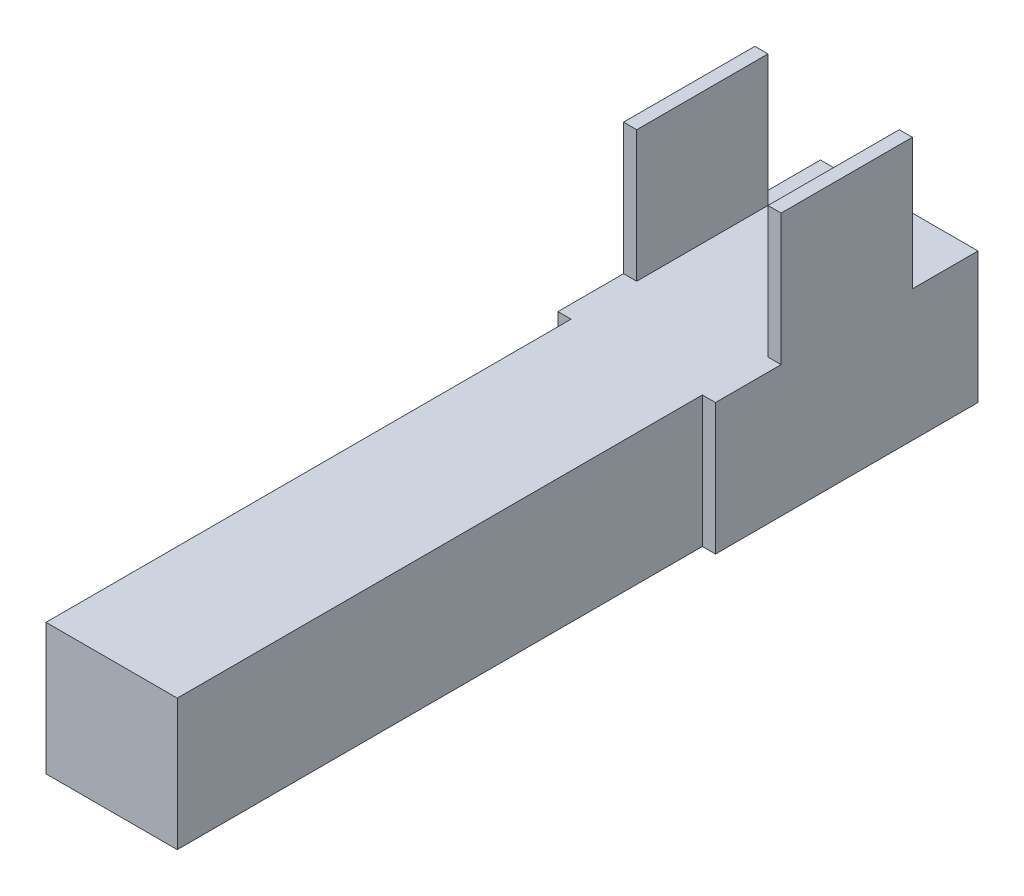
ISO-10303-21;
HEADER;
FILE_DESCRIPTION(('STEP AP214'),'2;1');
FILE_NAME('part.step','',(''),(''),'','','');
FILE_SCHEMA(('AUTOMOTIVE_DESIGN { 1 0 10303 214 1 1 1 1 }'));
ENDSEC;
DATA;
#1=APPLICATION_CONTEXT('core data for automotive mechanical design processes');
#2=APPLICATION_PROTOCOL_DEFINITION('international standard','automotive_design',2000,#1);
#3=PRODUCT_CONTEXT('',#1,'mechanical');
#4=PRODUCT('Part','Part','',(#3));
#5=PRODUCT_RELATED_PRODUCT_CATEGORY('part','',(#4));
#6=PRODUCT_DEFINITION_FORMATION('','',#4);
#7=PRODUCT_DEFINITION_CONTEXT('part definition',#1,'design');
#8=PRODUCT_DEFINITION('design','',#6,#7);
#9=PRODUCT_DEFINITION_SHAPE('','',#8);
#10=(LENGTH_UNIT() NAMED_UNIT(*) SI_UNIT(.MILLI.,.METRE.));
#11=(NAMED_UNIT(*) PLANE_ANGLE_UNIT() SI_UNIT($,.RADIAN.));
#12=(NAMED_UNIT(*) SI_UNIT($,.STERADIAN.) SOLID_ANGLE_UNIT());
#13=UNCERTAINTY_MEASURE_WITH_UNIT(LENGTH_MEASURE(1.E-05),#10,'distance_accuracy_value','');
#14=(GEOMETRIC_REPRESENTATION_CONTEXT(3) GLOBAL_UNCERTAINTY_ASSIGNED_CONTEXT((#13)) GLOBAL_UNIT_ASSIGNED_CONTEXT((#10,
#11,#12)) REPRESENTATION_CONTEXT('',''));
#15=CARTESIAN_POINT('',(0.,0.,0.));
#16=DIRECTION('',(0.,0.,1.));
#17=DIRECTION('',(1.,0.,0.));
#18=AXIS2_PLACEMENT_3D('',#15,#16,#17);
#19=CARTESIAN_POINT('',(0.,25.4,0.));
#20=DIRECTION('',(0.,-1.,0.));
#21=DIRECTION('',(0.,0.,-1.));
#22=AXIS2_PLACEMENT_3D('',#19,#20,#21);
#23=PLANE('',#22);
#24=DIRECTION('',(0.,0.,1.));
#25=VECTOR('',#24,1.);
#26=CARTESIAN_POINT('',(-12.7,25.4,-114.3));
#27=LINE('',#26,#25);
#28=CARTESIAN_POINT('',(-12.7,25.4,-139.7));
#29=VERTEX_POINT('',#28);
#30=CARTESIAN_POINT('',(-12.7,25.4,-114.3));
#31=VERTEX_POINT('',#30);
#32=EDGE_CURVE('E52',#29,#31,#27,.T.);
#33=ORIENTED_EDGE('',*,*,#32,.T.);
#34=DIRECTION('',(-1.,0.,0.));
#35=VECTOR('',#34,1.);
#36=CARTESIAN_POINT('',(-12.7,25.4,-114.3));
#37=LINE('',#36,#35);
#38=CARTESIAN_POINT('',(-15.24,25.4,-114.3));
#39=VERTEX_POINT('',#38);
#40=EDGE_CURVE('E181',#31,#39,#37,.T.);
#41=ORIENTED_EDGE('',*,*,#40,.T.);
#42=DIRECTION('',(0.,0.,1.));
#43=VECTOR('',#42,1.);
#44=CARTESIAN_POINT('',(-15.24,25.4,-152.4));
#45=LINE('',#44,#43);
#46=CARTESIAN_POINT('',(-15.24,25.4,-101.6));
#47=VERTEX_POINT('',#46);
#48=EDGE_CURVE('E158',#39,#47,#45,.T.);
#49=ORIENTED_EDGE('',*,*,#48,.T.);
#50=DIRECTION('',(1.,0.,0.));
#51=VECTOR('',#50,1.);
#52=CARTESIAN_POINT('',(-15.24,25.4,-101.6));
#53=LINE('',#52,#51);
#54=CARTESIAN_POINT('',(-12.7,25.4,-101.6));
#55=VERTEX_POINT('',#54);
#56=EDGE_CURVE('E198',#47,#55,#53,.T.);
#57=ORIENTED_EDGE('',*,*,#56,.T.);
#58=DIRECTION('',(0.,0.,-1.));
#59=VECTOR('',#58,1.);
#60=CARTESIAN_POINT('',(-12.7,25.4,0.));
#61=LINE('',#60,#59);
#62=CARTESIAN_POINT('',(-12.7,25.4,0.));
#63=VERTEX_POINT('',#62);
#64=EDGE_CURVE('E207',#63,#55,#61,.T.);
#65=ORIENTED_EDGE('',*,*,#64,.F.);
#66=DIRECTION('',(1.,0.,0.));
#67=VECTOR('',#66,1.);
#68=CARTESIAN_POINT('',(0.,25.4,0.));
#69=LINE('',#68,#67);
#70=CARTESIAN_POINT('',(12.7,25.4,0.));
#71=VERTEX_POINT('',#70);
#72=EDGE_CURVE('E265',#63,#71,#69,.T.);
#73=ORIENTED_EDGE('',*,*,#72,.T.);
#74=DIRECTION('',(0.,0.,-1.));
#75=VECTOR('',#74,1.);
#76=CARTESIAN_POINT('',(12.7,25.4,0.));
#77=LINE('',#76,#75);
#78=CARTESIAN_POINT('',(12.7,25.4,-101.6));
#79=VERTEX_POINT('',#78);
#80=EDGE_CURVE('E267',#71,#79,#77,.T.);
#81=ORIENTED_EDGE('',*,*,#80,.T.);
#82=DIRECTION('',(-1.,0.,0.));
#83=VECTOR('',#82,1.);
#84=CARTESIAN_POINT('',(15.24,25.4,-101.6));
#85=LINE('',#84,#83);
#86=CARTESIAN_POINT('',(15.24,25.4,-101.6));
#87=VERTEX_POINT('',#86);
#88=EDGE_CURVE('E262',#87,#79,#85,.T.);
#89=ORIENTED_EDGE('',*,*,#88,.F.);
#90=DIRECTION('',(0.,0.,1.));
#91=VECTOR('',#90,1.);
#92=CARTESIAN_POINT('',(15.24,25.4,-152.4));
#93=LINE('',#92,#91);
#94=CARTESIAN_POINT('',(15.24,25.4,-114.3));
#95=VERTEX_POINT('',#94);
#96=EDGE_CURVE('E249',#95,#87,#93,.T.);
#97=ORIENTED_EDGE('',*,*,#96,.F.);
#98=DIRECTION('',(1.,0.,0.));
#99=VECTOR('',#98,1.);
#100=CARTESIAN_POINT('',(12.7,25.4,-114.3));
#101=LINE('',#100,#99);
#102=CARTESIAN_POINT('',(12.7,25.4,-114.3));
#103=VERTEX_POINT('',#102);
#104=EDGE_CURVE('E219',#103,#95,#101,.T.);
#105=ORIENTED_EDGE('',*,*,#104,.F.);
#106=DIRECTION('',(0.,0.,1.));
#107=VECTOR('',#106,1.);
#108=CARTESIAN_POINT('',(12.7,25.4,-114.3));
#109=LINE('',#108,#107);
#110=CARTESIAN_POINT('',(12.7,25.4,-139.7));
#111=VERTEX_POINT('',#110);
#112=EDGE_CURVE('E228',#111,#103,#109,.T.);
#113=ORIENTED_EDGE('',*,*,#112,.F.);
#114=DIRECTION('',(-1.,0.,0.));
#115=VECTOR('',#114,1.);
#116=CARTESIAN_POINT('',(12.7,25.4,-139.7));
#117=LINE('',#116,#115);
#118=CARTESIAN_POINT('',(15.24,25.4,-139.7));
#119=VERTEX_POINT('',#118);
#120=EDGE_CURVE('E214',#119,#111,#117,.T.);
#121=ORIENTED_EDGE('',*,*,#120,.F.);
#122=CARTESIAN_POINT('',(15.24,25.4,-152.4));
#123=VERTEX_POINT('',#122);
#124=EDGE_CURVE('E245',#123,#119,#93,.T.);
#125=ORIENTED_EDGE('',*,*,#124,.F.);
#126=DIRECTION('',(-1.,0.,0.));
#127=VECTOR('',#126,1.);
#128=CARTESIAN_POINT('',(0.,25.4,-152.4));
#129=LINE('',#128,#127);
#130=CARTESIAN_POINT('',(-15.24,25.4,-152.4));
#131=VERTEX_POINT('',#130);
#132=EDGE_CURVE('E45',#123,#131,#129,.T.);
#133=ORIENTED_EDGE('',*,*,#132,.T.);
#134=CARTESIAN_POINT('',(-15.24,25.4,-139.7));
#135=VERTEX_POINT('',#134);
#136=EDGE_CURVE('E189',#131,#135,#45,.T.);
#137=ORIENTED_EDGE('',*,*,#136,.T.);
#138=DIRECTION('',(1.,0.,0.));
#139=VECTOR('',#138,1.);
#140=CARTESIAN_POINT('',(-12.7,25.4,-139.7));
#141=LINE('',#140,#139);
#142=EDGE_CURVE('E57',#135,#29,#141,.T.);
#143=ORIENTED_EDGE('',*,*,#142,.T.);
#144=EDGE_LOOP('',(#33,#41,#49,#57,#65,#73,#81,#89,#97,#105,#113,#121,#125,#133,#137,#143));
#145=FACE_BOUND('',#144,.T.);
#146=ADVANCED_FACE('F37',(#145),#23,.F.);
#147=CARTESIAN_POINT('',(0.,25.4,0.));
#148=DIRECTION('',(0.,0.,-1.));
#149=DIRECTION('',(-1.,0.,0.));
#150=AXIS2_PLACEMENT_3D('',#147,#148,#149);
#151=PLANE('',#150);
#152=DIRECTION('',(1.,0.,0.));
#153=VECTOR('',#152,1.);
#154=CARTESIAN_POINT('',(0.,0.,0.));
#155=LINE('',#154,#153);
#156=CARTESIAN_POINT('',(-12.7,0.,0.));
#157=VERTEX_POINT('',#156);
#158=CARTESIAN_POINT('',(12.7,0.,0.));
#159=VERTEX_POINT('',#158);
#160=EDGE_CURVE('E264',#157,#159,#155,.T.);
#161=ORIENTED_EDGE('',*,*,#160,.T.);
#162=DIRECTION('',(0.,-1.,0.));
#163=VECTOR('',#162,1.);
#164=CARTESIAN_POINT('',(12.7,25.4,0.));
#165=LINE('',#164,#163);
#166=EDGE_CURVE('E11',#71,#159,#165,.T.);
#167=ORIENTED_EDGE('',*,*,#166,.F.);
#168=ORIENTED_EDGE('',*,*,#72,.F.);
#169=DIRECTION('',(0.,-1.,0.));
#170=VECTOR('',#169,1.);
#171=CARTESIAN_POINT('',(-12.7,25.4,0.));
#172=LINE('',#171,#170);
#173=EDGE_CURVE('E209',#63,#157,#172,.T.);
#174=ORIENTED_EDGE('',*,*,#173,.T.);
#175=EDGE_LOOP('',(#161,#167,#168,#174));
#176=FACE_BOUND('',#175,.T.);
#177=ADVANCED_FACE('F39',(#176),#151,.F.);
#178=CARTESIAN_POINT('',(12.7,25.4,0.));
#179=DIRECTION('',(-1.,0.,0.));
#180=DIRECTION('',(0.,0.,1.));
#181=AXIS2_PLACEMENT_3D('',#178,#179,#180);
#182=PLANE('',#181);
#183=DIRECTION('',(0.,0.,-1.));
#184=VECTOR('',#183,1.);
#185=CARTESIAN_POINT('',(12.7,0.,0.));
#186=LINE('',#185,#184);
#187=CARTESIAN_POINT('',(12.7,0.,-101.6));
#188=VERTEX_POINT('',#187);
#189=EDGE_CURVE('E273',#159,#188,#186,.T.);
#190=ORIENTED_EDGE('',*,*,#189,.T.);
#191=DIRECTION('',(0.,1.,0.));
#192=VECTOR('',#191,1.);
#193=CARTESIAN_POINT('',(12.7,0.,-101.6));
#194=LINE('',#193,#192);
#195=EDGE_CURVE('E244',#188,#79,#194,.T.);
#196=ORIENTED_EDGE('',*,*,#195,.T.);
#197=ORIENTED_EDGE('',*,*,#80,.F.);
#198=ORIENTED_EDGE('',*,*,#166,.T.);
#199=EDGE_LOOP('',(#190,#196,#197,#198));
#200=FACE_BOUND('',#199,.T.);
#201=ADVANCED_FACE('F297',(#200),#182,.F.);
#202=CARTESIAN_POINT('',(0.,25.4,-152.4));
#203=DIRECTION('',(0.,0.,1.));
#204=DIRECTION('',(1.,0.,0.));
#205=AXIS2_PLACEMENT_3D('',#202,#203,#204);
#206=PLANE('',#205);
#207=DIRECTION('',(-1.,0.,0.));
#208=VECTOR('',#207,1.);
#209=CARTESIAN_POINT('',(0.,0.,-152.4));
#210=LINE('',#209,#208);
#211=CARTESIAN_POINT('',(15.24,0.,-152.4));
#212=VERTEX_POINT('',#211);
#213=CARTESIAN_POINT('',(-15.24,0.,-152.4));
#214=VERTEX_POINT('',#213);
#215=EDGE_CURVE('E268',#212,#214,#210,.T.);
#216=ORIENTED_EDGE('',*,*,#215,.T.);
#217=DIRECTION('',(0.,1.,0.));
#218=VECTOR('',#217,1.);
#219=CARTESIAN_POINT('',(-15.24,0.,-152.4));
#220=LINE('',#219,#218);
#221=EDGE_CURVE('E191',#214,#131,#220,.T.);
#222=ORIENTED_EDGE('',*,*,#221,.T.);
#223=ORIENTED_EDGE('',*,*,#132,.F.);
#224=DIRECTION('',(0.,1.,0.));
#225=VECTOR('',#224,1.);
#226=CARTESIAN_POINT('',(15.24,0.,-152.4));
#227=LINE('',#226,#225);
#228=EDGE_CURVE('E255',#212,#123,#227,.T.);
#229=ORIENTED_EDGE('',*,*,#228,.F.);
#230=EDGE_LOOP('',(#216,#222,#223,#229));
#231=FACE_BOUND('',#230,.T.);
#232=ADVANCED_FACE('F278',(#231),#206,.F.);
#233=CARTESIAN_POINT('',(0.,0.,0.));
#234=DIRECTION('',(0.,-1.,0.));
#235=DIRECTION('',(0.,0.,-1.));
#236=AXIS2_PLACEMENT_3D('',#233,#234,#235);
#237=PLANE('',#236);
#238=ORIENTED_EDGE('',*,*,#160,.F.);
#239=DIRECTION('',(0.,0.,-1.));
#240=VECTOR('',#239,1.);
#241=CARTESIAN_POINT('',(-12.7,0.,0.));
#242=LINE('',#241,#240);
#243=CARTESIAN_POINT('',(-12.7,0.,-101.6));
#244=VERTEX_POINT('',#243);
#245=EDGE_CURVE('E206',#157,#244,#242,.T.);
#246=ORIENTED_EDGE('',*,*,#245,.T.);
#247=DIRECTION('',(1.,0.,0.));
#248=VECTOR('',#247,1.);
#249=CARTESIAN_POINT('',(-15.24,0.,-101.6));
#250=LINE('',#249,#248);
#251=CARTESIAN_POINT('',(-15.24,0.,-101.6));
#252=VERTEX_POINT('',#251);
#253=EDGE_CURVE('E203',#252,#244,#250,.T.);
#254=ORIENTED_EDGE('',*,*,#253,.F.);
#255=DIRECTION('',(0.,0.,1.));
#256=VECTOR('',#255,1.);
#257=CARTESIAN_POINT('',(-15.24,0.,-152.4));
#258=LINE('',#257,#256);
#259=EDGE_CURVE('E194',#214,#252,#258,.T.);
#260=ORIENTED_EDGE('',*,*,#259,.F.);
#261=ORIENTED_EDGE('',*,*,#215,.F.);
#262=DIRECTION('',(0.,0.,1.));
#263=VECTOR('',#262,1.);
#264=CARTESIAN_POINT('',(15.24,0.,-152.4));
#265=LINE('',#264,#263);
#266=CARTESIAN_POINT('',(15.24,0.,-101.6));
#267=VERTEX_POINT('',#266);
#268=EDGE_CURVE('E252',#212,#267,#265,.T.);
#269=ORIENTED_EDGE('',*,*,#268,.T.);
#270=DIRECTION('',(-1.,0.,0.));
#271=VECTOR('',#270,1.);
#272=CARTESIAN_POINT('',(15.24,0.,-101.6));
#273=LINE('',#272,#271);
#274=EDGE_CURVE('E258',#267,#188,#273,.T.);
#275=ORIENTED_EDGE('',*,*,#274,.T.);
#276=ORIENTED_EDGE('',*,*,#189,.F.);
#277=EDGE_LOOP('',(#238,#246,#254,#260,#261,#269,#275,#276));
#278=FACE_BOUND('',#277,.T.);
#279=ADVANCED_FACE('F283',(#278),#237,.T.);
#280=CARTESIAN_POINT('',(15.24,0.,-101.6));
#281=DIRECTION('',(0.,0.,1.));
#282=DIRECTION('',(1.,0.,0.));
#283=AXIS2_PLACEMENT_3D('',#280,#281,#282);
#284=PLANE('',#283);
#285=ORIENTED_EDGE('',*,*,#195,.F.);
#286=ORIENTED_EDGE('',*,*,#274,.F.);
#287=DIRECTION('',(0.,1.,0.));
#288=VECTOR('',#287,1.);
#289=CARTESIAN_POINT('',(15.24,0.,-101.6));
#290=LINE('',#289,#288);
#291=EDGE_CURVE('E248',#267,#87,#290,.T.);
#292=ORIENTED_EDGE('',*,*,#291,.T.);
#293=ORIENTED_EDGE('',*,*,#88,.T.);
#294=EDGE_LOOP('',(#285,#286,#292,#293));
#295=FACE_BOUND('',#294,.T.);
#296=ADVANCED_FACE('F293',(#295),#284,.T.);
#297=CARTESIAN_POINT('',(15.24,0.,0.));
#298=DIRECTION('',(-1.,0.,0.));
#299=DIRECTION('',(0.,0.,1.));
#300=AXIS2_PLACEMENT_3D('',#297,#298,#299);
#301=PLANE('',#300);
#302=ORIENTED_EDGE('',*,*,#124,.T.);
#303=DIRECTION('',(0.,-1.,0.));
#304=VECTOR('',#303,1.);
#305=CARTESIAN_POINT('',(15.24,50.8,-139.7));
#306=LINE('',#305,#304);
#307=CARTESIAN_POINT('',(15.24,50.8,-139.7));
#308=VERTEX_POINT('',#307);
#309=EDGE_CURVE('E241',#308,#119,#306,.T.);
#310=ORIENTED_EDGE('',*,*,#309,.F.);
#311=DIRECTION('',(0.,0.,-1.));
#312=VECTOR('',#311,1.);
#313=CARTESIAN_POINT('',(15.24,50.8,-114.3));
#314=LINE('',#313,#312);
#315=CARTESIAN_POINT('',(15.24,50.8,-114.3));
#316=VERTEX_POINT('',#315);
#317=EDGE_CURVE('E215',#316,#308,#314,.T.);
#318=ORIENTED_EDGE('',*,*,#317,.F.);
#319=DIRECTION('',(0.,-1.,0.));
#320=VECTOR('',#319,1.);
#321=CARTESIAN_POINT('',(15.24,50.8,-114.3));
#322=LINE('',#321,#320);
#323=EDGE_CURVE('E225',#316,#95,#322,.T.);
#324=ORIENTED_EDGE('',*,*,#323,.T.);
#325=ORIENTED_EDGE('',*,*,#96,.T.);
#326=ORIENTED_EDGE('',*,*,#291,.F.);
#327=ORIENTED_EDGE('',*,*,#268,.F.);
#328=ORIENTED_EDGE('',*,*,#228,.T.);
#329=EDGE_LOOP('',(#302,#310,#318,#324,#325,#326,#327,#328));
#330=FACE_BOUND('',#329,.T.);
#331=ADVANCED_FACE('F287',(#330),#301,.F.);
#332=CARTESIAN_POINT('',(12.7,50.8,-139.7));
#333=DIRECTION('',(0.,0.,1.));
#334=DIRECTION('',(1.,0.,0.));
#335=AXIS2_PLACEMENT_3D('',#332,#333,#334);
#336=PLANE('',#335);
#337=ORIENTED_EDGE('',*,*,#120,.T.);
#338=DIRECTION('',(0.,-1.,0.));
#339=VECTOR('',#338,1.);
#340=CARTESIAN_POINT('',(12.7,50.8,-139.7));
#341=LINE('',#340,#339);
#342=CARTESIAN_POINT('',(12.7,50.8,-139.7));
#343=VERTEX_POINT('',#342);
#344=EDGE_CURVE('E238',#343,#111,#341,.T.);
#345=ORIENTED_EDGE('',*,*,#344,.F.);
#346=DIRECTION('',(-1.,0.,0.));
#347=VECTOR('',#346,1.);
#348=CARTESIAN_POINT('',(12.7,50.8,-139.7));
#349=LINE('',#348,#347);
#350=EDGE_CURVE('E218',#308,#343,#349,.T.);
#351=ORIENTED_EDGE('',*,*,#350,.F.);
#352=ORIENTED_EDGE('',*,*,#309,.T.);
#353=EDGE_LOOP('',(#337,#345,#351,#352));
#354=FACE_BOUND('',#353,.T.);
#355=ADVANCED_FACE('F354',(#354),#336,.F.);
#356=CARTESIAN_POINT('',(12.7,50.8,-114.3));
#357=DIRECTION('',(1.,0.,0.));
#358=DIRECTION('',(0.,0.,-1.));
#359=AXIS2_PLACEMENT_3D('',#356,#357,#358);
#360=PLANE('',#359);
#361=ORIENTED_EDGE('',*,*,#112,.T.);
#362=DIRECTION('',(0.,-1.,0.));
#363=VECTOR('',#362,1.);
#364=CARTESIAN_POINT('',(12.7,50.8,-114.3));
#365=LINE('',#364,#363);
#366=CARTESIAN_POINT('',(12.7,50.8,-114.3));
#367=VERTEX_POINT('',#366);
#368=EDGE_CURVE('E235',#367,#103,#365,.T.);
#369=ORIENTED_EDGE('',*,*,#368,.F.);
#370=DIRECTION('',(0.,0.,1.));
#371=VECTOR('',#370,1.);
#372=CARTESIAN_POINT('',(12.7,50.8,-114.3));
#373=LINE('',#372,#371);
#374=EDGE_CURVE('E221',#343,#367,#373,.T.);
#375=ORIENTED_EDGE('',*,*,#374,.F.);
#376=ORIENTED_EDGE('',*,*,#344,.T.);
#377=EDGE_LOOP('',(#361,#369,#375,#376));
#378=FACE_BOUND('',#377,.T.);
#379=ADVANCED_FACE('F360',(#378),#360,.F.);
#380=CARTESIAN_POINT('',(12.7,50.8,-114.3));
#381=DIRECTION('',(0.,0.,-1.));
#382=DIRECTION('',(-1.,0.,0.));
#383=AXIS2_PLACEMENT_3D('',#380,#381,#382);
#384=PLANE('',#383);
#385=ORIENTED_EDGE('',*,*,#104,.T.);
#386=ORIENTED_EDGE('',*,*,#323,.F.);
#387=DIRECTION('',(1.,0.,0.));
#388=VECTOR('',#387,1.);
#389=CARTESIAN_POINT('',(12.7,50.8,-114.3));
#390=LINE('',#389,#388);
#391=EDGE_CURVE('E223',#367,#316,#390,.T.);
#392=ORIENTED_EDGE('',*,*,#391,.F.);
#393=ORIENTED_EDGE('',*,*,#368,.T.);
#394=EDGE_LOOP('',(#385,#386,#392,#393));
#395=FACE_BOUND('',#394,.T.);
#396=ADVANCED_FACE('F316',(#395),#384,.F.);
#397=CARTESIAN_POINT('',(0.,50.8,0.));
#398=DIRECTION('',(0.,-1.,0.));
#399=DIRECTION('',(0.,0.,-1.));
#400=AXIS2_PLACEMENT_3D('',#397,#398,#399);
#401=PLANE('',#400);
#402=ORIENTED_EDGE('',*,*,#317,.T.);
#403=ORIENTED_EDGE('',*,*,#350,.T.);
#404=ORIENTED_EDGE('',*,*,#374,.T.);
#405=ORIENTED_EDGE('',*,*,#391,.T.);
#406=EDGE_LOOP('',(#402,#403,#404,#405));
#407=FACE_BOUND('',#406,.T.);
#408=ADVANCED_FACE('F309',(#407),#401,.F.);
#409=CARTESIAN_POINT('',(-12.7,25.4,0.));
#410=DIRECTION('',(-1.,0.,0.));
#411=DIRECTION('',(0.,0.,1.));
#412=AXIS2_PLACEMENT_3D('',#409,#410,#411);
#413=PLANE('',#412);
#414=DIRECTION('',(0.,1.,0.));
#415=VECTOR('',#414,1.);
#416=CARTESIAN_POINT('',(-12.7,0.,-101.6));
#417=LINE('',#416,#415);
#418=EDGE_CURVE('E162',#244,#55,#417,.T.);
#419=ORIENTED_EDGE('',*,*,#418,.F.);
#420=ORIENTED_EDGE('',*,*,#245,.F.);
#421=ORIENTED_EDGE('',*,*,#173,.F.);
#422=ORIENTED_EDGE('',*,*,#64,.T.);
#423=EDGE_LOOP('',(#419,#420,#421,#422));
#424=FACE_BOUND('',#423,.T.);
#425=ADVANCED_FACE('F307',(#424),#413,.T.);
#426=CARTESIAN_POINT('',(-15.24,0.,-101.6));
#427=DIRECTION('',(0.,0.,-1.));
#428=DIRECTION('',(-1.,0.,0.));
#429=AXIS2_PLACEMENT_3D('',#426,#427,#428);
#430=PLANE('',#429);
#431=ORIENTED_EDGE('',*,*,#418,.T.);
#432=ORIENTED_EDGE('',*,*,#56,.F.);
#433=DIRECTION('',(0.,1.,0.));
#434=VECTOR('',#433,1.);
#435=CARTESIAN_POINT('',(-15.24,0.,-101.6));
#436=LINE('',#435,#434);
#437=EDGE_CURVE('E196',#252,#47,#436,.T.);
#438=ORIENTED_EDGE('',*,*,#437,.F.);
#439=ORIENTED_EDGE('',*,*,#253,.T.);
#440=EDGE_LOOP('',(#431,#432,#438,#439));
#441=FACE_BOUND('',#440,.T.);
#442=ADVANCED_FACE('F304',(#441),#430,.F.);
#443=CARTESIAN_POINT('',(-15.24,0.,0.));
#444=DIRECTION('',(1.,0.,0.));
#445=DIRECTION('',(0.,0.,1.));
#446=AXIS2_PLACEMENT_3D('',#443,#444,#445);
#447=PLANE('',#446);
#448=ORIENTED_EDGE('',*,*,#136,.F.);
#449=ORIENTED_EDGE('',*,*,#221,.F.);
#450=ORIENTED_EDGE('',*,*,#259,.T.);
#451=ORIENTED_EDGE('',*,*,#437,.T.);
#452=ORIENTED_EDGE('',*,*,#48,.F.);
#453=DIRECTION('',(0.,-1.,0.));
#454=VECTOR('',#453,1.);
#455=CARTESIAN_POINT('',(-15.24,50.8,-114.3));
#456=LINE('',#455,#454);
#457=CARTESIAN_POINT('',(-15.24,50.8,-114.3));
#458=VERTEX_POINT('',#457);
#459=EDGE_CURVE('E150',#458,#39,#456,.T.);
#460=ORIENTED_EDGE('',*,*,#459,.F.);
#461=DIRECTION('',(0.,0.,-1.));
#462=VECTOR('',#461,1.);
#463=CARTESIAN_POINT('',(-15.24,50.8,-114.3));
#464=LINE('',#463,#462);
#465=CARTESIAN_POINT('',(-15.24,50.8,-139.7));
#466=VERTEX_POINT('',#465);
#467=EDGE_CURVE('E155',#458,#466,#464,.T.);
#468=ORIENTED_EDGE('',*,*,#467,.T.);
#469=DIRECTION('',(0.,-1.,0.));
#470=VECTOR('',#469,1.);
#471=CARTESIAN_POINT('',(-15.24,50.8,-139.7));
#472=LINE('',#471,#470);
#473=EDGE_CURVE('E180',#466,#135,#472,.T.);
#474=ORIENTED_EDGE('',*,*,#473,.T.);
#475=EDGE_LOOP('',(#448,#449,#450,#451,#452,#460,#468,#474));
#476=FACE_BOUND('',#475,.T.);
#477=ADVANCED_FACE('F153',(#476),#447,.F.);
#478=CARTESIAN_POINT('',(-12.7,50.8,-114.3));
#479=DIRECTION('',(0.,0.,1.));
#480=DIRECTION('',(1.,0.,0.));
#481=AXIS2_PLACEMENT_3D('',#478,#479,#480);
#482=PLANE('',#481);
#483=ORIENTED_EDGE('',*,*,#40,.F.);
#484=DIRECTION('',(0.,-1.,0.));
#485=VECTOR('',#484,1.);
#486=CARTESIAN_POINT('',(-12.7,50.8,-114.3));
#487=LINE('',#486,#485);
#488=CARTESIAN_POINT('',(-12.7,50.8,-114.3));
#489=VERTEX_POINT('',#488);
#490=EDGE_CURVE('E163',#489,#31,#487,.T.);
#491=ORIENTED_EDGE('',*,*,#490,.F.);
#492=DIRECTION('',(-1.,0.,0.));
#493=VECTOR('',#492,1.);
#494=CARTESIAN_POINT('',(-12.7,50.8,-114.3));
#495=LINE('',#494,#493);
#496=EDGE_CURVE('E169',#489,#458,#495,.T.);
#497=ORIENTED_EDGE('',*,*,#496,.T.);
#498=ORIENTED_EDGE('',*,*,#459,.T.);
#499=EDGE_LOOP('',(#483,#491,#497,#498));
#500=FACE_BOUND('',#499,.T.);
#501=ADVANCED_FACE('F174',(#500),#482,.T.);
#502=CARTESIAN_POINT('',(-12.7,50.8,-114.3));
#503=DIRECTION('',(1.,0.,0.));
#504=DIRECTION('',(0.,0.,-1.));
#505=AXIS2_PLACEMENT_3D('',#502,#503,#504);
#506=PLANE('',#505);
#507=ORIENTED_EDGE('',*,*,#32,.F.);
#508=DIRECTION('',(0.,-1.,0.));
#509=VECTOR('',#508,1.);
#510=CARTESIAN_POINT('',(-12.7,50.8,-139.7));
#511=LINE('',#510,#509);
#512=CARTESIAN_POINT('',(-12.7,50.8,-139.7));
#513=VERTEX_POINT('',#512);
#514=EDGE_CURVE('E186',#513,#29,#511,.T.);
#515=ORIENTED_EDGE('',*,*,#514,.F.);
#516=DIRECTION('',(0.,0.,1.));
#517=VECTOR('',#516,1.);
#518=CARTESIAN_POINT('',(-12.7,50.8,-114.3));
#519=LINE('',#518,#517);
#520=EDGE_CURVE('E175',#513,#489,#519,.T.);
#521=ORIENTED_EDGE('',*,*,#520,.T.);
#522=ORIENTED_EDGE('',*,*,#490,.T.);
#523=EDGE_LOOP('',(#507,#515,#521,#522));
#524=FACE_BOUND('',#523,.T.);
#525=ADVANCED_FACE('F441',(#524),#506,.T.);
#526=CARTESIAN_POINT('',(-12.7,50.8,-139.7));
#527=DIRECTION('',(0.,0.,-1.));
#528=DIRECTION('',(-1.,0.,0.));
#529=AXIS2_PLACEMENT_3D('',#526,#527,#528);
#530=PLANE('',#529);
#531=ORIENTED_EDGE('',*,*,#142,.F.);
#532=ORIENTED_EDGE('',*,*,#473,.F.);
#533=DIRECTION('',(1.,0.,0.));
#534=VECTOR('',#533,1.);
#535=CARTESIAN_POINT('',(-12.7,50.8,-139.7));
#536=LINE('',#535,#534);
#537=EDGE_CURVE('E172',#466,#513,#536,.T.);
#538=ORIENTED_EDGE('',*,*,#537,.T.);
#539=ORIENTED_EDGE('',*,*,#514,.T.);
#540=EDGE_LOOP('',(#531,#532,#538,#539));
#541=FACE_BOUND('',#540,.T.);
#542=ADVANCED_FACE('F450',(#541),#530,.T.);
#543=CARTESIAN_POINT('',(0.,50.8,0.));
#544=DIRECTION('',(0.,-1.,0.));
#545=DIRECTION('',(0.,0.,-1.));
#546=AXIS2_PLACEMENT_3D('',#543,#544,#545);
#547=PLANE('',#546);
#548=ORIENTED_EDGE('',*,*,#467,.F.);
#549=ORIENTED_EDGE('',*,*,#496,.F.);
#550=ORIENTED_EDGE('',*,*,#520,.F.);
#551=ORIENTED_EDGE('',*,*,#537,.F.);
#552=EDGE_LOOP('',(#548,#549,#550,#551));
#553=FACE_BOUND('',#552,.T.);
#554=ADVANCED_FACE('F167',(#553),#547,.F.);
#555=CLOSED_SHELL('',(#146,#177,#201,#232,#279,#296,#331,#355,#379,#396,#408,#425,#442,#477,
#501,#525,#542,#554));
#556=MANIFOLD_SOLID_BREP('B2',#555);
#557=ADVANCED_BREP_SHAPE_REPRESENTATION('',(#18,#556),#14);
#558=SHAPE_DEFINITION_REPRESENTATION(#9,#557);
ENDSEC;
END-ISO-10303-21;
